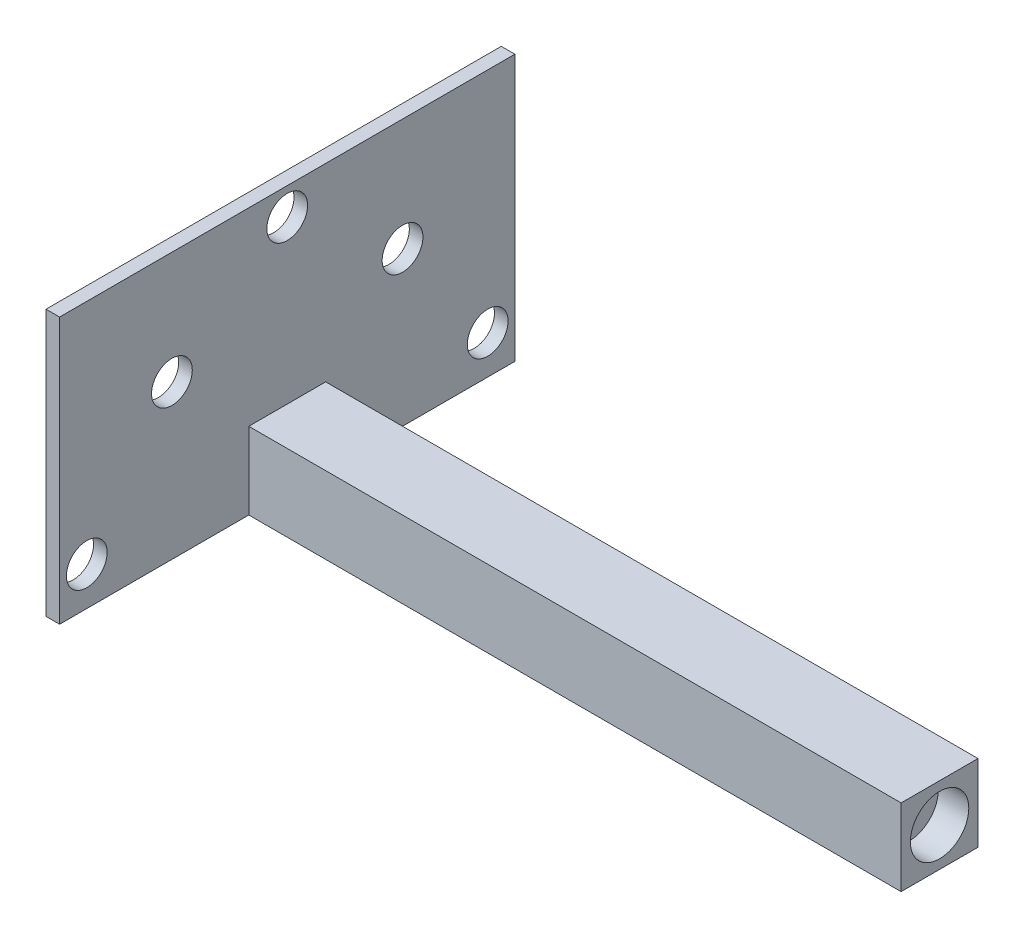
ISO-10303-21;
HEADER;
FILE_DESCRIPTION(('STEP AP214'),'2;1');
FILE_NAME('part.step','',(''),(''),'','','');
FILE_SCHEMA(('AUTOMOTIVE_DESIGN { 1 0 10303 214 1 1 1 1 }'));
ENDSEC;
DATA;
#1=APPLICATION_CONTEXT('core data for automotive mechanical design processes');
#2=APPLICATION_PROTOCOL_DEFINITION('international standard','automotive_design',2000,#1);
#3=PRODUCT_CONTEXT('',#1,'mechanical');
#4=PRODUCT('Part','Part','',(#3));
#5=PRODUCT_RELATED_PRODUCT_CATEGORY('part','',(#4));
#6=PRODUCT_DEFINITION_FORMATION('','',#4);
#7=PRODUCT_DEFINITION_CONTEXT('part definition',#1,'design');
#8=PRODUCT_DEFINITION('design','',#6,#7);
#9=PRODUCT_DEFINITION_SHAPE('','',#8);
#10=(LENGTH_UNIT() NAMED_UNIT(*) SI_UNIT(.MILLI.,.METRE.));
#11=(NAMED_UNIT(*) PLANE_ANGLE_UNIT() SI_UNIT($,.RADIAN.));
#12=(NAMED_UNIT(*) SI_UNIT($,.STERADIAN.) SOLID_ANGLE_UNIT());
#13=UNCERTAINTY_MEASURE_WITH_UNIT(LENGTH_MEASURE(1.E-05),#10,'distance_accuracy_value','');
#14=(GEOMETRIC_REPRESENTATION_CONTEXT(3) GLOBAL_UNCERTAINTY_ASSIGNED_CONTEXT((#13)) GLOBAL_UNIT_ASSIGNED_CONTEXT((#10,
#11,#12)) REPRESENTATION_CONTEXT('',''));
#15=CARTESIAN_POINT('',(0.,0.,0.));
#16=DIRECTION('',(0.,0.,1.));
#17=DIRECTION('',(1.,0.,0.));
#18=AXIS2_PLACEMENT_3D('',#15,#16,#17);
#19=CARTESIAN_POINT('',(1.,0.,0.));
#20=DIRECTION('',(1.,0.,0.));
#21=DIRECTION('',(0.,0.,-1.));
#22=AXIS2_PLACEMENT_3D('',#19,#20,#21);
#23=PLANE('',#22);
#24=CARTESIAN_POINT('',(1.,8.48528137423854,-8.4852813742386));
#25=DIRECTION('',(1.,0.,0.));
#26=DIRECTION('',(0.,0.,-1.));
#27=AXIS2_PLACEMENT_3D('',#24,#25,#26);
#28=CIRCLE('',#27,1.5);
#29=CARTESIAN_POINT('',(1.,8.48528137423854,-9.9852813742386));
#30=VERTEX_POINT('',#29);
#31=EDGE_CURVE('E138',#30,#30,#28,.T.);
#32=ORIENTED_EDGE('',*,*,#31,.F.);
#33=EDGE_LOOP('',(#32));
#34=FACE_BOUND('',#33,.T.);
#35=CARTESIAN_POINT('',(1.,8.48528137423857,8.48528137423857));
#36=DIRECTION('',(1.,0.,0.));
#37=DIRECTION('',(0.,0.,-1.));
#38=AXIS2_PLACEMENT_3D('',#35,#36,#37);
#39=CIRCLE('',#38,1.5);
#40=CARTESIAN_POINT('',(1.,8.48528137423857,6.98528137423857));
#41=VERTEX_POINT('',#40);
#42=EDGE_CURVE('E141',#41,#41,#39,.T.);
#43=ORIENTED_EDGE('',*,*,#42,.F.);
#44=EDGE_LOOP('',(#43));
#45=FACE_BOUND('',#44,.T.);
#46=CARTESIAN_POINT('',(1.,0.,14.75));
#47=DIRECTION('',(1.,0.,0.));
#48=DIRECTION('',(0.,0.,-1.));
#49=AXIS2_PLACEMENT_3D('',#46,#47,#48);
#50=CIRCLE('',#49,1.5);
#51=CARTESIAN_POINT('',(1.,0.,13.25));
#52=VERTEX_POINT('',#51);
#53=EDGE_CURVE('E145',#52,#52,#50,.T.);
#54=ORIENTED_EDGE('',*,*,#53,.F.);
#55=EDGE_LOOP('',(#54));
#56=FACE_BOUND('',#55,.T.);
#57=CARTESIAN_POINT('',(1.,0.,-14.75));
#58=DIRECTION('',(1.,0.,0.));
#59=DIRECTION('',(0.,0.,-1.));
#60=AXIS2_PLACEMENT_3D('',#57,#58,#59);
#61=CIRCLE('',#60,1.5);
#62=CARTESIAN_POINT('',(1.,0.,-16.25));
#63=VERTEX_POINT('',#62);
#64=EDGE_CURVE('E148',#63,#63,#61,.T.);
#65=ORIENTED_EDGE('',*,*,#64,.F.);
#66=EDGE_LOOP('',(#65));
#67=FACE_BOUND('',#66,.T.);
#68=CARTESIAN_POINT('',(1.,14.75,0.));
#69=DIRECTION('',(1.,0.,0.));
#70=DIRECTION('',(0.,0.,-1.));
#71=AXIS2_PLACEMENT_3D('',#68,#69,#70);
#72=CIRCLE('',#71,1.5);
#73=CARTESIAN_POINT('',(1.,14.75,-1.5));
#74=VERTEX_POINT('',#73);
#75=EDGE_CURVE('E151',#74,#74,#72,.T.);
#76=ORIENTED_EDGE('',*,*,#75,.F.);
#77=EDGE_LOOP('',(#76));
#78=FACE_BOUND('',#77,.T.);
#79=DIRECTION('',(0.,0.,1.));
#80=VECTOR('',#79,1.);
#81=CARTESIAN_POINT('',(1.,2.82842712474619,0.));
#82=LINE('',#81,#80);
#83=CARTESIAN_POINT('',(1.,2.82842712474619,-2.82842712474619));
#84=VERTEX_POINT('',#83);
#85=CARTESIAN_POINT('',(1.,2.82842712474619,2.82842712474619));
#86=VERTEX_POINT('',#85);
#87=EDGE_CURVE('E55',#84,#86,#82,.T.);
#88=ORIENTED_EDGE('',*,*,#87,.F.);
#89=DIRECTION('',(0.,-1.,0.));
#90=VECTOR('',#89,1.);
#91=CARTESIAN_POINT('',(1.,0.,-2.82842712474619));
#92=LINE('',#91,#90);
#93=CARTESIAN_POINT('',(1.,-2.82842712474619,-2.82842712474619));
#94=VERTEX_POINT('',#93);
#95=EDGE_CURVE('E135',#84,#94,#92,.T.);
#96=ORIENTED_EDGE('',*,*,#95,.T.);
#97=DIRECTION('',(0.,0.,-1.));
#98=VECTOR('',#97,1.);
#99=CARTESIAN_POINT('',(1.,-2.82842712474619,0.));
#100=LINE('',#99,#98);
#101=CARTESIAN_POINT('',(1.,-2.82842712474619,-16.75));
#102=VERTEX_POINT('',#101);
#103=EDGE_CURVE('E127',#94,#102,#100,.T.);
#104=ORIENTED_EDGE('',*,*,#103,.T.);
#105=DIRECTION('',(0.,1.,0.));
#106=VECTOR('',#105,1.);
#107=CARTESIAN_POINT('',(1.,0.,-16.75));
#108=LINE('',#107,#106);
#109=CARTESIAN_POINT('',(1.,16.75,-16.75));
#110=VERTEX_POINT('',#109);
#111=EDGE_CURVE('E159',#102,#110,#108,.T.);
#112=ORIENTED_EDGE('',*,*,#111,.T.);
#113=DIRECTION('',(0.,0.,-1.));
#114=VECTOR('',#113,1.);
#115=CARTESIAN_POINT('',(1.,16.75,0.));
#116=LINE('',#115,#114);
#117=CARTESIAN_POINT('',(1.,16.75,16.75));
#118=VERTEX_POINT('',#117);
#119=EDGE_CURVE('E161',#118,#110,#116,.T.);
#120=ORIENTED_EDGE('',*,*,#119,.F.);
#121=DIRECTION('',(0.,1.,0.));
#122=VECTOR('',#121,1.);
#123=CARTESIAN_POINT('',(1.,0.,16.75));
#124=LINE('',#123,#122);
#125=CARTESIAN_POINT('',(1.,-2.82842712474619,16.75));
#126=VERTEX_POINT('',#125);
#127=EDGE_CURVE('E154',#126,#118,#124,.T.);
#128=ORIENTED_EDGE('',*,*,#127,.F.);
#129=CARTESIAN_POINT('',(1.,-2.82842712474619,2.82842712474619));
#130=VERTEX_POINT('',#129);
#131=EDGE_CURVE('E157',#126,#130,#100,.T.);
#132=ORIENTED_EDGE('',*,*,#131,.T.);
#133=DIRECTION('',(0.,-1.,0.));
#134=VECTOR('',#133,1.);
#135=CARTESIAN_POINT('',(1.,0.,2.82842712474619));
#136=LINE('',#135,#134);
#137=EDGE_CURVE('E60',#86,#130,#136,.T.);
#138=ORIENTED_EDGE('',*,*,#137,.F.);
#139=EDGE_LOOP('',(#88,#96,#104,#112,#120,#128,#132,#138));
#140=FACE_BOUND('',#139,.T.);
#141=ADVANCED_FACE('F40',(#34,#45,#56,#67,#78,#140),#23,.T.);
#142=CARTESIAN_POINT('',(1.,0.,16.75));
#143=DIRECTION('',(0.,0.,1.));
#144=DIRECTION('',(1.,0.,0.));
#145=AXIS2_PLACEMENT_3D('',#142,#143,#144);
#146=PLANE('',#145);
#147=DIRECTION('',(0.,1.,0.));
#148=VECTOR('',#147,1.);
#149=CARTESIAN_POINT('',(0.,0.,16.75));
#150=LINE('',#149,#148);
#151=CARTESIAN_POINT('',(0.,-2.82842712474619,16.75));
#152=VERTEX_POINT('',#151);
#153=CARTESIAN_POINT('',(0.,16.75,16.75));
#154=VERTEX_POINT('',#153);
#155=EDGE_CURVE('E179',#152,#154,#150,.T.);
#156=ORIENTED_EDGE('',*,*,#155,.F.);
#157=DIRECTION('',(-1.,0.,0.));
#158=VECTOR('',#157,1.);
#159=CARTESIAN_POINT('',(1.,-2.82842712474619,16.75));
#160=LINE('',#159,#158);
#161=EDGE_CURVE('E11',#126,#152,#160,.T.);
#162=ORIENTED_EDGE('',*,*,#161,.F.);
#163=ORIENTED_EDGE('',*,*,#127,.T.);
#164=DIRECTION('',(-1.,0.,0.));
#165=VECTOR('',#164,1.);
#166=CARTESIAN_POINT('',(1.,16.75,16.75));
#167=LINE('',#166,#165);
#168=EDGE_CURVE('E164',#118,#154,#167,.T.);
#169=ORIENTED_EDGE('',*,*,#168,.T.);
#170=EDGE_LOOP('',(#156,#162,#163,#169));
#171=FACE_BOUND('',#170,.T.);
#172=ADVANCED_FACE('F228',(#171),#146,.T.);
#173=CARTESIAN_POINT('',(1.,-2.82842712474619,0.));
#174=DIRECTION('',(0.,1.,0.));
#175=DIRECTION('',(0.,0.,1.));
#176=AXIS2_PLACEMENT_3D('',#173,#174,#175);
#177=PLANE('',#176);
#178=DIRECTION('',(0.,0.,-1.));
#179=VECTOR('',#178,1.);
#180=CARTESIAN_POINT('',(0.,-2.82842712474619,0.));
#181=LINE('',#180,#179);
#182=CARTESIAN_POINT('',(0.,-2.82842712474619,-16.75));
#183=VERTEX_POINT('',#182);
#184=EDGE_CURVE('E182',#152,#183,#181,.T.);
#185=ORIENTED_EDGE('',*,*,#184,.T.);
#186=DIRECTION('',(-1.,0.,0.));
#187=VECTOR('',#186,1.);
#188=CARTESIAN_POINT('',(1.,-2.82842712474619,-16.75));
#189=LINE('',#188,#187);
#190=EDGE_CURVE('E48',#102,#183,#189,.T.);
#191=ORIENTED_EDGE('',*,*,#190,.F.);
#192=ORIENTED_EDGE('',*,*,#103,.F.);
#193=DIRECTION('',(-1.,0.,0.));
#194=VECTOR('',#193,1.);
#195=CARTESIAN_POINT('',(49.,-2.82842712474619,-2.82842712474619));
#196=LINE('',#195,#194);
#197=CARTESIAN_POINT('',(49.,-2.82842712474619,-2.82842712474619));
#198=VERTEX_POINT('',#197);
#199=EDGE_CURVE('E106',#198,#94,#196,.T.);
#200=ORIENTED_EDGE('',*,*,#199,.F.);
#201=DIRECTION('',(0.,0.,-1.));
#202=VECTOR('',#201,1.);
#203=CARTESIAN_POINT('',(49.,-2.82842712474619,0.));
#204=LINE('',#203,#202);
#205=CARTESIAN_POINT('',(49.,-2.82842712474619,2.82842712474619));
#206=VERTEX_POINT('',#205);
#207=EDGE_CURVE('E113',#206,#198,#204,.T.);
#208=ORIENTED_EDGE('',*,*,#207,.F.);
#209=DIRECTION('',(-1.,0.,0.));
#210=VECTOR('',#209,1.);
#211=CARTESIAN_POINT('',(49.,-2.82842712474619,2.82842712474619));
#212=LINE('',#211,#210);
#213=EDGE_CURVE('E212',#206,#130,#212,.T.);
#214=ORIENTED_EDGE('',*,*,#213,.T.);
#215=ORIENTED_EDGE('',*,*,#131,.F.);
#216=ORIENTED_EDGE('',*,*,#161,.T.);
#217=EDGE_LOOP('',(#185,#191,#192,#200,#208,#214,#215,#216));
#218=FACE_BOUND('',#217,.T.);
#219=ADVANCED_FACE('F125',(#218),#177,.F.);
#220=CARTESIAN_POINT('',(1.,0.,-16.75));
#221=DIRECTION('',(0.,0.,1.));
#222=DIRECTION('',(1.,0.,0.));
#223=AXIS2_PLACEMENT_3D('',#220,#221,#222);
#224=PLANE('',#223);
#225=DIRECTION('',(0.,1.,0.));
#226=VECTOR('',#225,1.);
#227=CARTESIAN_POINT('',(0.,0.,-16.75));
#228=LINE('',#227,#226);
#229=CARTESIAN_POINT('',(0.,16.75,-16.75));
#230=VERTEX_POINT('',#229);
#231=EDGE_CURVE('E184',#183,#230,#228,.T.);
#232=ORIENTED_EDGE('',*,*,#231,.T.);
#233=DIRECTION('',(-1.,0.,0.));
#234=VECTOR('',#233,1.);
#235=CARTESIAN_POINT('',(1.,16.75,-16.75));
#236=LINE('',#235,#234);
#237=EDGE_CURVE('E190',#110,#230,#236,.T.);
#238=ORIENTED_EDGE('',*,*,#237,.F.);
#239=ORIENTED_EDGE('',*,*,#111,.F.);
#240=ORIENTED_EDGE('',*,*,#190,.T.);
#241=EDGE_LOOP('',(#232,#238,#239,#240));
#242=FACE_BOUND('',#241,.T.);
#243=ADVANCED_FACE('F194',(#242),#224,.F.);
#244=CARTESIAN_POINT('',(1.,14.75,0.));
#245=DIRECTION('',(-1.,0.,0.));
#246=DIRECTION('',(0.,0.,1.));
#247=AXIS2_PLACEMENT_3D('',#244,#245,#246);
#248=CYLINDRICAL_SURFACE('',#247,1.5);
#249=ORIENTED_EDGE('',*,*,#75,.T.);
#250=EDGE_LOOP('',(#249));
#251=FACE_BOUND('',#250,.T.);
#252=CARTESIAN_POINT('',(0.,14.75,0.));
#253=DIRECTION('',(1.,0.,0.));
#254=DIRECTION('',(0.,0.,-1.));
#255=AXIS2_PLACEMENT_3D('',#252,#253,#254);
#256=CIRCLE('',#255,1.5);
#257=CARTESIAN_POINT('',(0.,14.75,-1.5));
#258=VERTEX_POINT('',#257);
#259=EDGE_CURVE('E176',#258,#258,#256,.T.);
#260=ORIENTED_EDGE('',*,*,#259,.F.);
#261=EDGE_LOOP('',(#260));
#262=FACE_BOUND('',#261,.T.);
#263=ADVANCED_FACE('F247',(#251,#262),#248,.F.);
#264=CARTESIAN_POINT('',(1.,0.,-14.75));
#265=DIRECTION('',(-1.,0.,0.));
#266=DIRECTION('',(0.,0.,1.));
#267=AXIS2_PLACEMENT_3D('',#264,#265,#266);
#268=CYLINDRICAL_SURFACE('',#267,1.5);
#269=ORIENTED_EDGE('',*,*,#64,.T.);
#270=EDGE_LOOP('',(#269));
#271=FACE_BOUND('',#270,.T.);
#272=CARTESIAN_POINT('',(0.,0.,-14.75));
#273=DIRECTION('',(1.,0.,0.));
#274=DIRECTION('',(0.,0.,-1.));
#275=AXIS2_PLACEMENT_3D('',#272,#273,#274);
#276=CIRCLE('',#275,1.5);
#277=CARTESIAN_POINT('',(0.,0.,-16.25));
#278=VERTEX_POINT('',#277);
#279=EDGE_CURVE('E173',#278,#278,#276,.T.);
#280=ORIENTED_EDGE('',*,*,#279,.F.);
#281=EDGE_LOOP('',(#280));
#282=FACE_BOUND('',#281,.T.);
#283=ADVANCED_FACE('F251',(#271,#282),#268,.F.);
#284=CARTESIAN_POINT('',(1.,0.,14.75));
#285=DIRECTION('',(-1.,0.,0.));
#286=DIRECTION('',(0.,0.,1.));
#287=AXIS2_PLACEMENT_3D('',#284,#285,#286);
#288=CYLINDRICAL_SURFACE('',#287,1.5);
#289=ORIENTED_EDGE('',*,*,#53,.T.);
#290=EDGE_LOOP('',(#289));
#291=FACE_BOUND('',#290,.T.);
#292=CARTESIAN_POINT('',(0.,0.,14.75));
#293=DIRECTION('',(1.,0.,0.));
#294=DIRECTION('',(0.,0.,-1.));
#295=AXIS2_PLACEMENT_3D('',#292,#293,#294);
#296=CIRCLE('',#295,1.5);
#297=CARTESIAN_POINT('',(0.,0.,13.25));
#298=VERTEX_POINT('',#297);
#299=EDGE_CURVE('E170',#298,#298,#296,.T.);
#300=ORIENTED_EDGE('',*,*,#299,.F.);
#301=EDGE_LOOP('',(#300));
#302=FACE_BOUND('',#301,.T.);
#303=ADVANCED_FACE('F255',(#291,#302),#288,.F.);
#304=CARTESIAN_POINT('',(1.,8.48528137423857,8.48528137423857));
#305=DIRECTION('',(-1.,0.,0.));
#306=DIRECTION('',(0.,0.,1.));
#307=AXIS2_PLACEMENT_3D('',#304,#305,#306);
#308=CYLINDRICAL_SURFACE('',#307,1.5);
#309=ORIENTED_EDGE('',*,*,#42,.T.);
#310=EDGE_LOOP('',(#309));
#311=FACE_BOUND('',#310,.T.);
#312=CARTESIAN_POINT('',(0.,8.48528137423857,8.48528137423857));
#313=DIRECTION('',(1.,0.,0.));
#314=DIRECTION('',(0.,0.,-1.));
#315=AXIS2_PLACEMENT_3D('',#312,#313,#314);
#316=CIRCLE('',#315,1.5);
#317=CARTESIAN_POINT('',(0.,8.48528137423857,6.98528137423857));
#318=VERTEX_POINT('',#317);
#319=EDGE_CURVE('E167',#318,#318,#316,.T.);
#320=ORIENTED_EDGE('',*,*,#319,.F.);
#321=EDGE_LOOP('',(#320));
#322=FACE_BOUND('',#321,.T.);
#323=ADVANCED_FACE('F258',(#311,#322),#308,.F.);
#324=CARTESIAN_POINT('',(1.,8.48528137423854,-8.4852813742386));
#325=DIRECTION('',(-1.,0.,0.));
#326=DIRECTION('',(0.,0.,1.));
#327=AXIS2_PLACEMENT_3D('',#324,#325,#326);
#328=CYLINDRICAL_SURFACE('',#327,1.5);
#329=ORIENTED_EDGE('',*,*,#31,.T.);
#330=EDGE_LOOP('',(#329));
#331=FACE_BOUND('',#330,.T.);
#332=CARTESIAN_POINT('',(0.,8.48528137423854,-8.4852813742386));
#333=DIRECTION('',(1.,0.,0.));
#334=DIRECTION('',(0.,0.,-1.));
#335=AXIS2_PLACEMENT_3D('',#332,#333,#334);
#336=CIRCLE('',#335,1.5);
#337=CARTESIAN_POINT('',(0.,8.48528137423854,-9.9852813742386));
#338=VERTEX_POINT('',#337);
#339=EDGE_CURVE('E137',#338,#338,#336,.T.);
#340=ORIENTED_EDGE('',*,*,#339,.F.);
#341=EDGE_LOOP('',(#340));
#342=FACE_BOUND('',#341,.T.);
#343=ADVANCED_FACE('F42',(#331,#342),#328,.F.);
#344=CARTESIAN_POINT('',(1.,16.75,0.));
#345=DIRECTION('',(0.,1.,0.));
#346=DIRECTION('',(0.,0.,1.));
#347=AXIS2_PLACEMENT_3D('',#344,#345,#346);
#348=PLANE('',#347);
#349=DIRECTION('',(0.,0.,-1.));
#350=VECTOR('',#349,1.);
#351=CARTESIAN_POINT('',(0.,16.75,0.));
#352=LINE('',#351,#350);
#353=EDGE_CURVE('E142',#154,#230,#352,.T.);
#354=ORIENTED_EDGE('',*,*,#353,.F.);
#355=ORIENTED_EDGE('',*,*,#168,.F.);
#356=ORIENTED_EDGE('',*,*,#119,.T.);
#357=ORIENTED_EDGE('',*,*,#237,.T.);
#358=EDGE_LOOP('',(#354,#355,#356,#357));
#359=FACE_BOUND('',#358,.T.);
#360=ADVANCED_FACE('F205',(#359),#348,.T.);
#361=CARTESIAN_POINT('',(0.,0.,0.));
#362=DIRECTION('',(1.,0.,0.));
#363=DIRECTION('',(0.,0.,-1.));
#364=AXIS2_PLACEMENT_3D('',#361,#362,#363);
#365=PLANE('',#364);
#366=ORIENTED_EDGE('',*,*,#231,.F.);
#367=ORIENTED_EDGE('',*,*,#184,.F.);
#368=ORIENTED_EDGE('',*,*,#155,.T.);
#369=ORIENTED_EDGE('',*,*,#353,.T.);
#370=EDGE_LOOP('',(#366,#367,#368,#369));
#371=FACE_BOUND('',#370,.T.);
#372=ORIENTED_EDGE('',*,*,#259,.T.);
#373=EDGE_LOOP('',(#372));
#374=FACE_BOUND('',#373,.T.);
#375=ORIENTED_EDGE('',*,*,#279,.T.);
#376=EDGE_LOOP('',(#375));
#377=FACE_BOUND('',#376,.T.);
#378=ORIENTED_EDGE('',*,*,#299,.T.);
#379=EDGE_LOOP('',(#378));
#380=FACE_BOUND('',#379,.T.);
#381=ORIENTED_EDGE('',*,*,#319,.T.);
#382=EDGE_LOOP('',(#381));
#383=FACE_BOUND('',#382,.T.);
#384=ORIENTED_EDGE('',*,*,#339,.T.);
#385=EDGE_LOOP('',(#384));
#386=FACE_BOUND('',#385,.T.);
#387=ADVANCED_FACE('F201',(#371,#374,#377,#380,#383,#386),#365,.F.);
#388=CARTESIAN_POINT('',(49.,0.,-2.82842712474619));
#389=DIRECTION('',(0.,0.,1.));
#390=DIRECTION('',(1.,0.,0.));
#391=AXIS2_PLACEMENT_3D('',#388,#389,#390);
#392=PLANE('',#391);
#393=ORIENTED_EDGE('',*,*,#95,.F.);
#394=DIRECTION('',(-1.,0.,0.));
#395=VECTOR('',#394,1.);
#396=CARTESIAN_POINT('',(49.,2.82842712474619,-2.82842712474619));
#397=LINE('',#396,#395);
#398=CARTESIAN_POINT('',(49.,2.82842712474619,-2.82842712474619));
#399=VERTEX_POINT('',#398);
#400=EDGE_CURVE('E108',#399,#84,#397,.T.);
#401=ORIENTED_EDGE('',*,*,#400,.F.);
#402=DIRECTION('',(0.,1.,0.));
#403=VECTOR('',#402,1.);
#404=CARTESIAN_POINT('',(49.,0.,-2.82842712474619));
#405=LINE('',#404,#403);
#406=EDGE_CURVE('E102',#198,#399,#405,.T.);
#407=ORIENTED_EDGE('',*,*,#406,.F.);
#408=ORIENTED_EDGE('',*,*,#199,.T.);
#409=EDGE_LOOP('',(#393,#401,#407,#408));
#410=FACE_BOUND('',#409,.T.);
#411=ADVANCED_FACE('F104',(#410),#392,.F.);
#412=CARTESIAN_POINT('',(49.,2.82842712474619,0.));
#413=DIRECTION('',(0.,1.,0.));
#414=DIRECTION('',(0.,0.,1.));
#415=AXIS2_PLACEMENT_3D('',#412,#413,#414);
#416=PLANE('',#415);
#417=ORIENTED_EDGE('',*,*,#400,.T.);
#418=ORIENTED_EDGE('',*,*,#87,.T.);
#419=DIRECTION('',(-1.,0.,0.));
#420=VECTOR('',#419,1.);
#421=CARTESIAN_POINT('',(49.,2.82842712474619,2.82842712474619));
#422=LINE('',#421,#420);
#423=CARTESIAN_POINT('',(49.,2.82842712474619,2.82842712474619));
#424=VERTEX_POINT('',#423);
#425=EDGE_CURVE('E130',#424,#86,#422,.T.);
#426=ORIENTED_EDGE('',*,*,#425,.F.);
#427=DIRECTION('',(0.,0.,-1.));
#428=VECTOR('',#427,1.);
#429=CARTESIAN_POINT('',(49.,2.82842712474619,0.));
#430=LINE('',#429,#428);
#431=EDGE_CURVE('E112',#424,#399,#430,.T.);
#432=ORIENTED_EDGE('',*,*,#431,.T.);
#433=EDGE_LOOP('',(#417,#418,#426,#432));
#434=FACE_BOUND('',#433,.T.);
#435=ADVANCED_FACE('F209',(#434),#416,.T.);
#436=CARTESIAN_POINT('',(49.,0.,2.82842712474619));
#437=DIRECTION('',(0.,0.,1.));
#438=DIRECTION('',(1.,0.,0.));
#439=AXIS2_PLACEMENT_3D('',#436,#437,#438);
#440=PLANE('',#439);
#441=ORIENTED_EDGE('',*,*,#425,.T.);
#442=ORIENTED_EDGE('',*,*,#137,.T.);
#443=ORIENTED_EDGE('',*,*,#213,.F.);
#444=DIRECTION('',(0.,1.,0.));
#445=VECTOR('',#444,1.);
#446=CARTESIAN_POINT('',(49.,0.,2.82842712474619));
#447=LINE('',#446,#445);
#448=EDGE_CURVE('E119',#206,#424,#447,.T.);
#449=ORIENTED_EDGE('',*,*,#448,.T.);
#450=EDGE_LOOP('',(#441,#442,#443,#449));
#451=FACE_BOUND('',#450,.T.);
#452=ADVANCED_FACE('F216',(#451),#440,.T.);
#453=CARTESIAN_POINT('',(49.,0.,0.));
#454=DIRECTION('',(1.,0.,0.));
#455=DIRECTION('',(0.,0.,-1.));
#456=AXIS2_PLACEMENT_3D('',#453,#454,#455);
#457=PLANE('',#456);
#458=CARTESIAN_POINT('',(49.,0.,0.));
#459=DIRECTION('',(1.,0.,0.));
#460=DIRECTION('',(0.,0.,-1.));
#461=AXIS2_PLACEMENT_3D('',#458,#459,#460);
#462=CIRCLE('',#461,2.15);
#463=CARTESIAN_POINT('',(49.,0.,-2.15));
#464=VERTEX_POINT('',#463);
#465=EDGE_CURVE('E370',#464,#464,#462,.T.);
#466=ORIENTED_EDGE('',*,*,#465,.F.);
#467=EDGE_LOOP('',(#466));
#468=FACE_BOUND('',#467,.T.);
#469=ORIENTED_EDGE('',*,*,#207,.T.);
#470=ORIENTED_EDGE('',*,*,#406,.T.);
#471=ORIENTED_EDGE('',*,*,#431,.F.);
#472=ORIENTED_EDGE('',*,*,#448,.F.);
#473=EDGE_LOOP('',(#469,#470,#471,#472));
#474=FACE_BOUND('',#473,.T.);
#475=ADVANCED_FACE('F117',(#468,#474),#457,.T.);
#476=CARTESIAN_POINT('',(46.75,0.,0.));
#477=DIRECTION('',(1.,0.,0.));
#478=DIRECTION('',(0.,0.,-1.));
#479=AXIS2_PLACEMENT_3D('',#476,#477,#478);
#480=CYLINDRICAL_SURFACE('',#479,2.15);
#481=CARTESIAN_POINT('',(46.75,0.,0.));
#482=DIRECTION('',(1.,0.,0.));
#483=DIRECTION('',(0.,0.,-1.));
#484=AXIS2_PLACEMENT_3D('',#481,#482,#483);
#485=CIRCLE('',#484,2.15);
#486=CARTESIAN_POINT('',(46.75,0.,-2.15));
#487=VERTEX_POINT('',#486);
#488=EDGE_CURVE('E122',#487,#487,#485,.T.);
#489=ORIENTED_EDGE('',*,*,#488,.F.);
#490=EDGE_LOOP('',(#489));
#491=FACE_BOUND('',#490,.T.);
#492=ORIENTED_EDGE('',*,*,#465,.T.);
#493=EDGE_LOOP('',(#492));
#494=FACE_BOUND('',#493,.T.);
#495=ADVANCED_FACE('F223',(#491,#494),#480,.F.);
#496=CARTESIAN_POINT('',(46.75,0.,0.));
#497=DIRECTION('',(1.,0.,0.));
#498=DIRECTION('',(0.,0.,-1.));
#499=AXIS2_PLACEMENT_3D('',#496,#497,#498);
#500=PLANE('',#499);
#501=ORIENTED_EDGE('',*,*,#488,.T.);
#502=EDGE_LOOP('',(#501));
#503=FACE_BOUND('',#502,.T.);
#504=ADVANCED_FACE('F355',(#503),#500,.T.);
#505=CLOSED_SHELL('',(#141,#172,#219,#243,#263,#283,#303,#323,#343,#360,#387,#411,#435,#452,
#475,#495,#504));
#506=MANIFOLD_SOLID_BREP('B2',#505);
#507=ADVANCED_BREP_SHAPE_REPRESENTATION('',(#18,#506),#14);
#508=SHAPE_DEFINITION_REPRESENTATION(#9,#507);
ENDSEC;
END-ISO-10303-21;
